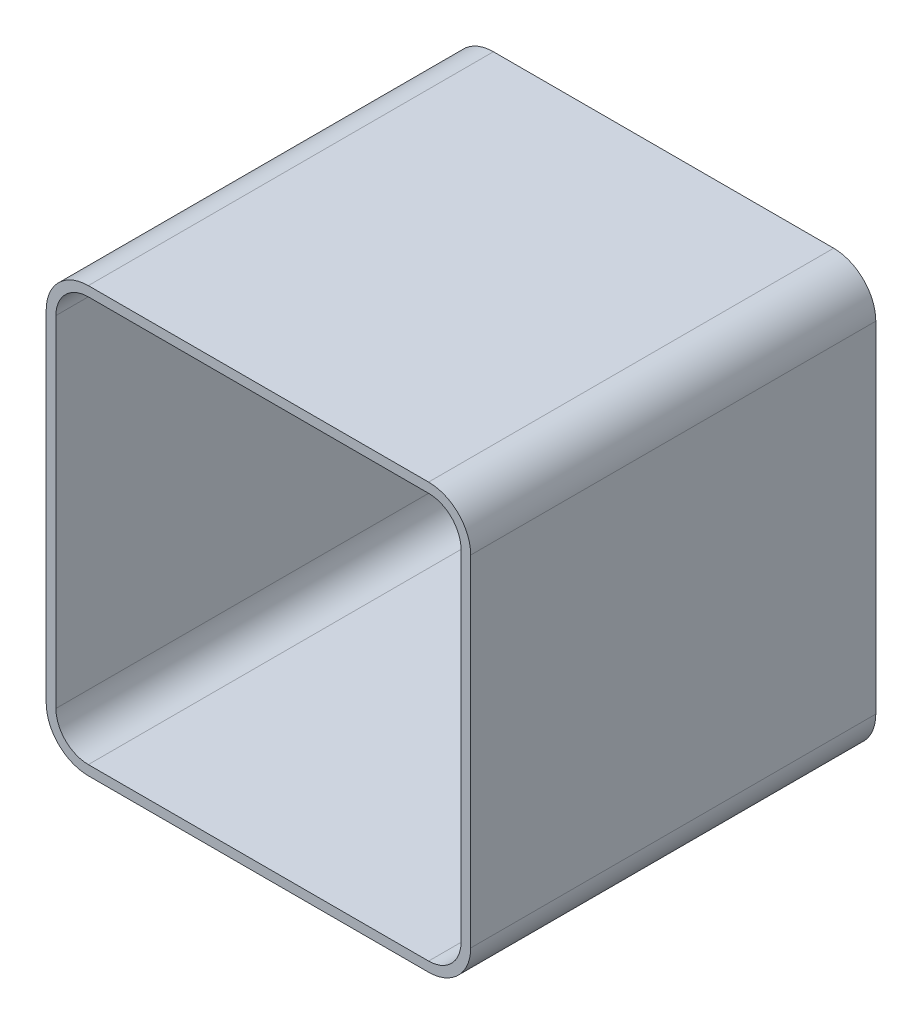
ISO-10303-21;
HEADER;
FILE_DESCRIPTION(('STEP AP214'),'2;1');
FILE_NAME('part.step','',(''),(''),'','','');
FILE_SCHEMA(('AUTOMOTIVE_DESIGN { 1 0 10303 214 1 1 1 1 }'));
ENDSEC;
DATA;
#1=APPLICATION_CONTEXT('core data for automotive mechanical design processes');
#2=APPLICATION_PROTOCOL_DEFINITION('international standard','automotive_design',2000,#1);
#3=PRODUCT_CONTEXT('',#1,'mechanical');
#4=PRODUCT('Part','Part','',(#3));
#5=PRODUCT_RELATED_PRODUCT_CATEGORY('part','',(#4));
#6=PRODUCT_DEFINITION_FORMATION('','',#4);
#7=PRODUCT_DEFINITION_CONTEXT('part definition',#1,'design');
#8=PRODUCT_DEFINITION('design','',#6,#7);
#9=PRODUCT_DEFINITION_SHAPE('','',#8);
#10=(LENGTH_UNIT() NAMED_UNIT(*) SI_UNIT(.MILLI.,.METRE.));
#11=(NAMED_UNIT(*) PLANE_ANGLE_UNIT() SI_UNIT($,.RADIAN.));
#12=(NAMED_UNIT(*) SI_UNIT($,.STERADIAN.) SOLID_ANGLE_UNIT());
#13=UNCERTAINTY_MEASURE_WITH_UNIT(LENGTH_MEASURE(1.E-05),#10,'distance_accuracy_value','');
#14=(GEOMETRIC_REPRESENTATION_CONTEXT(3) GLOBAL_UNCERTAINTY_ASSIGNED_CONTEXT((#13)) GLOBAL_UNIT_ASSIGNED_CONTEXT((#10,
#11,#12)) REPRESENTATION_CONTEXT('',''));
#15=CARTESIAN_POINT('',(0.,0.,0.));
#16=DIRECTION('',(0.,0.,1.));
#17=DIRECTION('',(1.,0.,0.));
#18=AXIS2_PLACEMENT_3D('',#15,#16,#17);
#19=CARTESIAN_POINT('',(0.,0.,25.));
#20=DIRECTION('',(0.,0.,1.));
#21=DIRECTION('',(1.,0.,0.));
#22=AXIS2_PLACEMENT_3D('',#19,#20,#21);
#23=PLANE('',#22);
#24=DIRECTION('',(-1.,0.,0.));
#25=VECTOR('',#24,1.);
#26=CARTESIAN_POINT('',(-13.1,13.1,25.));
#27=LINE('',#26,#25);
#28=CARTESIAN_POINT('',(10.5,13.1,25.));
#29=VERTEX_POINT('',#28);
#30=CARTESIAN_POINT('',(-10.5,13.1,25.));
#31=VERTEX_POINT('',#30);
#32=EDGE_CURVE('E248',#29,#31,#27,.T.);
#33=ORIENTED_EDGE('',*,*,#32,.T.);
#34=CARTESIAN_POINT('',(-10.5,10.5,25.));
#35=DIRECTION('',(0.,0.,1.));
#36=DIRECTION('',(1.,0.,0.));
#37=AXIS2_PLACEMENT_3D('',#34,#35,#36);
#38=CIRCLE('',#37,2.6);
#39=CARTESIAN_POINT('',(-13.1,10.5,25.));
#40=VERTEX_POINT('',#39);
#41=EDGE_CURVE('E230',#31,#40,#38,.T.);
#42=ORIENTED_EDGE('',*,*,#41,.T.);
#43=DIRECTION('',(0.,-1.,0.));
#44=VECTOR('',#43,1.);
#45=CARTESIAN_POINT('',(-13.1,13.1,25.));
#46=LINE('',#45,#44);
#47=CARTESIAN_POINT('',(-13.1,-10.5,25.));
#48=VERTEX_POINT('',#47);
#49=EDGE_CURVE('E176',#40,#48,#46,.T.);
#50=ORIENTED_EDGE('',*,*,#49,.T.);
#51=CARTESIAN_POINT('',(-10.5,-10.5,25.));
#52=DIRECTION('',(0.,0.,1.));
#53=DIRECTION('',(1.,0.,0.));
#54=AXIS2_PLACEMENT_3D('',#51,#52,#53);
#55=CIRCLE('',#54,2.6);
#56=CARTESIAN_POINT('',(-10.5,-13.1,25.));
#57=VERTEX_POINT('',#56);
#58=EDGE_CURVE('E53',#48,#57,#55,.T.);
#59=ORIENTED_EDGE('',*,*,#58,.T.);
#60=DIRECTION('',(1.,0.,0.));
#61=VECTOR('',#60,1.);
#62=CARTESIAN_POINT('',(-13.1,-13.1,25.));
#63=LINE('',#62,#61);
#64=CARTESIAN_POINT('',(10.5,-13.1,25.));
#65=VERTEX_POINT('',#64);
#66=EDGE_CURVE('E172',#57,#65,#63,.T.);
#67=ORIENTED_EDGE('',*,*,#66,.T.);
#68=CARTESIAN_POINT('',(10.5,-10.5,25.));
#69=DIRECTION('',(0.,0.,1.));
#70=DIRECTION('',(1.,0.,0.));
#71=AXIS2_PLACEMENT_3D('',#68,#69,#70);
#72=CIRCLE('',#71,2.6);
#73=CARTESIAN_POINT('',(13.1,-10.5,25.));
#74=VERTEX_POINT('',#73);
#75=EDGE_CURVE('E226',#65,#74,#72,.T.);
#76=ORIENTED_EDGE('',*,*,#75,.T.);
#77=DIRECTION('',(0.,1.,0.));
#78=VECTOR('',#77,1.);
#79=CARTESIAN_POINT('',(13.1,13.1,25.));
#80=LINE('',#79,#78);
#81=CARTESIAN_POINT('',(13.1,10.5,25.));
#82=VERTEX_POINT('',#81);
#83=EDGE_CURVE('E245',#74,#82,#80,.T.);
#84=ORIENTED_EDGE('',*,*,#83,.T.);
#85=CARTESIAN_POINT('',(10.5,10.5,25.));
#86=DIRECTION('',(0.,0.,1.));
#87=DIRECTION('',(1.,0.,0.));
#88=AXIS2_PLACEMENT_3D('',#85,#86,#87);
#89=CIRCLE('',#88,2.6);
#90=EDGE_CURVE('E228',#82,#29,#89,.T.);
#91=ORIENTED_EDGE('',*,*,#90,.T.);
#92=EDGE_LOOP('',(#33,#42,#50,#59,#67,#76,#84,#91));
#93=FACE_BOUND('',#92,.T.);
#94=DIRECTION('',(-1.,0.,0.));
#95=VECTOR('',#94,1.);
#96=CARTESIAN_POINT('',(-12.5,12.5,25.));
#97=LINE('',#96,#95);
#98=CARTESIAN_POINT('',(10.5,12.5,25.));
#99=VERTEX_POINT('',#98);
#100=CARTESIAN_POINT('',(-10.5,12.5,25.));
#101=VERTEX_POINT('',#100);
#102=EDGE_CURVE('E273',#99,#101,#97,.T.);
#103=ORIENTED_EDGE('',*,*,#102,.F.);
#104=CARTESIAN_POINT('',(10.5,10.5,25.));
#105=DIRECTION('',(0.,0.,1.));
#106=DIRECTION('',(1.,0.,0.));
#107=AXIS2_PLACEMENT_3D('',#104,#105,#106);
#108=CIRCLE('',#107,2.);
#109=CARTESIAN_POINT('',(12.5,10.5,25.));
#110=VERTEX_POINT('',#109);
#111=EDGE_CURVE('E158',#99,#110,#108,.F.);
#112=ORIENTED_EDGE('',*,*,#111,.T.);
#113=DIRECTION('',(0.,1.,0.));
#114=VECTOR('',#113,1.);
#115=CARTESIAN_POINT('',(12.5,12.5,25.));
#116=LINE('',#115,#114);
#117=CARTESIAN_POINT('',(12.5,-10.5,25.));
#118=VERTEX_POINT('',#117);
#119=EDGE_CURVE('E263',#118,#110,#116,.T.);
#120=ORIENTED_EDGE('',*,*,#119,.F.);
#121=CARTESIAN_POINT('',(10.5,-10.5,25.));
#122=DIRECTION('',(0.,0.,1.));
#123=DIRECTION('',(1.,0.,0.));
#124=AXIS2_PLACEMENT_3D('',#121,#122,#123);
#125=CIRCLE('',#124,2.);
#126=CARTESIAN_POINT('',(10.5,-12.5,25.));
#127=VERTEX_POINT('',#126);
#128=EDGE_CURVE('E201',#118,#127,#125,.F.);
#129=ORIENTED_EDGE('',*,*,#128,.T.);
#130=DIRECTION('',(1.,0.,0.));
#131=VECTOR('',#130,1.);
#132=CARTESIAN_POINT('',(-12.5,-12.5,25.));
#133=LINE('',#132,#131);
#134=CARTESIAN_POINT('',(-10.5,-12.5,25.));
#135=VERTEX_POINT('',#134);
#136=EDGE_CURVE('E258',#135,#127,#133,.T.);
#137=ORIENTED_EDGE('',*,*,#136,.F.);
#138=CARTESIAN_POINT('',(-10.5,-10.5,25.));
#139=DIRECTION('',(0.,0.,1.));
#140=DIRECTION('',(1.,0.,0.));
#141=AXIS2_PLACEMENT_3D('',#138,#139,#140);
#142=CIRCLE('',#141,2.);
#143=CARTESIAN_POINT('',(-12.5,-10.5,25.));
#144=VERTEX_POINT('',#143);
#145=EDGE_CURVE('E197',#135,#144,#142,.F.);
#146=ORIENTED_EDGE('',*,*,#145,.T.);
#147=DIRECTION('',(0.,-1.,0.));
#148=VECTOR('',#147,1.);
#149=CARTESIAN_POINT('',(-12.5,12.5,25.));
#150=LINE('',#149,#148);
#151=CARTESIAN_POINT('',(-12.5,10.5,25.));
#152=VERTEX_POINT('',#151);
#153=EDGE_CURVE('E271',#152,#144,#150,.T.);
#154=ORIENTED_EDGE('',*,*,#153,.F.);
#155=CARTESIAN_POINT('',(-10.5,10.5,25.));
#156=DIRECTION('',(0.,0.,1.));
#157=DIRECTION('',(1.,0.,0.));
#158=AXIS2_PLACEMENT_3D('',#155,#156,#157);
#159=CIRCLE('',#158,2.);
#160=EDGE_CURVE('E157',#152,#101,#159,.F.);
#161=ORIENTED_EDGE('',*,*,#160,.T.);
#162=EDGE_LOOP('',(#103,#112,#120,#129,#137,#146,#154,#161));
#163=FACE_BOUND('',#162,.T.);
#164=ADVANCED_FACE('F33',(#93,#163),#23,.T.);
#165=CARTESIAN_POINT('',(0.,0.,0.));
#166=DIRECTION('',(0.,0.,1.));
#167=DIRECTION('',(1.,0.,0.));
#168=AXIS2_PLACEMENT_3D('',#165,#166,#167);
#169=PLANE('',#168);
#170=DIRECTION('',(0.,-1.,0.));
#171=VECTOR('',#170,1.);
#172=CARTESIAN_POINT('',(-13.1,13.1,0.));
#173=LINE('',#172,#171);
#174=CARTESIAN_POINT('',(-13.1,10.5,0.));
#175=VERTEX_POINT('',#174);
#176=CARTESIAN_POINT('',(-13.1,-10.5,0.));
#177=VERTEX_POINT('',#176);
#178=EDGE_CURVE('E246',#175,#177,#173,.T.);
#179=ORIENTED_EDGE('',*,*,#178,.F.);
#180=CARTESIAN_POINT('',(-10.5,10.5,0.));
#181=DIRECTION('',(0.,0.,1.));
#182=DIRECTION('',(1.,0.,0.));
#183=AXIS2_PLACEMENT_3D('',#180,#181,#182);
#184=CIRCLE('',#183,2.6);
#185=CARTESIAN_POINT('',(-10.5,13.1,0.));
#186=VERTEX_POINT('',#185);
#187=EDGE_CURVE('E218',#175,#186,#184,.F.);
#188=ORIENTED_EDGE('',*,*,#187,.T.);
#189=DIRECTION('',(-1.,0.,0.));
#190=VECTOR('',#189,1.);
#191=CARTESIAN_POINT('',(-13.1,13.1,0.));
#192=LINE('',#191,#190);
#193=CARTESIAN_POINT('',(10.5,13.1,0.));
#194=VERTEX_POINT('',#193);
#195=EDGE_CURVE('E250',#194,#186,#192,.T.);
#196=ORIENTED_EDGE('',*,*,#195,.F.);
#197=CARTESIAN_POINT('',(10.5,10.5,0.));
#198=DIRECTION('',(0.,0.,1.));
#199=DIRECTION('',(1.,0.,0.));
#200=AXIS2_PLACEMENT_3D('',#197,#198,#199);
#201=CIRCLE('',#200,2.6);
#202=CARTESIAN_POINT('',(13.1,10.5,0.));
#203=VERTEX_POINT('',#202);
#204=EDGE_CURVE('E216',#194,#203,#201,.F.);
#205=ORIENTED_EDGE('',*,*,#204,.T.);
#206=DIRECTION('',(0.,1.,0.));
#207=VECTOR('',#206,1.);
#208=CARTESIAN_POINT('',(13.1,13.1,0.));
#209=LINE('',#208,#207);
#210=CARTESIAN_POINT('',(13.1,-10.5,0.));
#211=VERTEX_POINT('',#210);
#212=EDGE_CURVE('E254',#211,#203,#209,.T.);
#213=ORIENTED_EDGE('',*,*,#212,.F.);
#214=CARTESIAN_POINT('',(10.5,-10.5,0.));
#215=DIRECTION('',(0.,0.,1.));
#216=DIRECTION('',(1.,0.,0.));
#217=AXIS2_PLACEMENT_3D('',#214,#215,#216);
#218=CIRCLE('',#217,2.6);
#219=CARTESIAN_POINT('',(10.5,-13.1,0.));
#220=VERTEX_POINT('',#219);
#221=EDGE_CURVE('E214',#211,#220,#218,.F.);
#222=ORIENTED_EDGE('',*,*,#221,.T.);
#223=DIRECTION('',(1.,0.,0.));
#224=VECTOR('',#223,1.);
#225=CARTESIAN_POINT('',(-13.1,-13.1,0.));
#226=LINE('',#225,#224);
#227=CARTESIAN_POINT('',(-10.5,-13.1,0.));
#228=VERTEX_POINT('',#227);
#229=EDGE_CURVE('E179',#228,#220,#226,.T.);
#230=ORIENTED_EDGE('',*,*,#229,.F.);
#231=CARTESIAN_POINT('',(-10.5,-10.5,0.));
#232=DIRECTION('',(0.,0.,1.));
#233=DIRECTION('',(1.,0.,0.));
#234=AXIS2_PLACEMENT_3D('',#231,#232,#233);
#235=CIRCLE('',#234,2.6);
#236=EDGE_CURVE('E212',#228,#177,#235,.F.);
#237=ORIENTED_EDGE('',*,*,#236,.T.);
#238=EDGE_LOOP('',(#179,#188,#196,#205,#213,#222,#230,#237));
#239=FACE_BOUND('',#238,.T.);
#240=DIRECTION('',(1.,0.,0.));
#241=VECTOR('',#240,1.);
#242=CARTESIAN_POINT('',(-12.5,-12.5,0.));
#243=LINE('',#242,#241);
#244=CARTESIAN_POINT('',(-10.5,-12.5,0.));
#245=VERTEX_POINT('',#244);
#246=CARTESIAN_POINT('',(10.5,-12.5,0.));
#247=VERTEX_POINT('',#246);
#248=EDGE_CURVE('E168',#245,#247,#243,.T.);
#249=ORIENTED_EDGE('',*,*,#248,.T.);
#250=CARTESIAN_POINT('',(10.5,-10.5,0.));
#251=DIRECTION('',(0.,0.,1.));
#252=DIRECTION('',(1.,0.,0.));
#253=AXIS2_PLACEMENT_3D('',#250,#251,#252);
#254=CIRCLE('',#253,2.);
#255=CARTESIAN_POINT('',(12.5,-10.5,0.));
#256=VERTEX_POINT('',#255);
#257=EDGE_CURVE('E199',#247,#256,#254,.T.);
#258=ORIENTED_EDGE('',*,*,#257,.T.);
#259=DIRECTION('',(0.,1.,0.));
#260=VECTOR('',#259,1.);
#261=CARTESIAN_POINT('',(12.5,12.5,0.));
#262=LINE('',#261,#260);
#263=CARTESIAN_POINT('',(12.5,10.5,0.));
#264=VERTEX_POINT('',#263);
#265=EDGE_CURVE('E266',#256,#264,#262,.T.);
#266=ORIENTED_EDGE('',*,*,#265,.T.);
#267=CARTESIAN_POINT('',(10.5,10.5,0.));
#268=DIRECTION('',(0.,0.,1.));
#269=DIRECTION('',(1.,0.,0.));
#270=AXIS2_PLACEMENT_3D('',#267,#268,#269);
#271=CIRCLE('',#270,2.);
#272=CARTESIAN_POINT('',(10.5,12.5,0.));
#273=VERTEX_POINT('',#272);
#274=EDGE_CURVE('E203',#264,#273,#271,.T.);
#275=ORIENTED_EDGE('',*,*,#274,.T.);
#276=DIRECTION('',(-1.,0.,0.));
#277=VECTOR('',#276,1.);
#278=CARTESIAN_POINT('',(-12.5,12.5,0.));
#279=LINE('',#278,#277);
#280=CARTESIAN_POINT('',(-10.5,12.5,0.));
#281=VERTEX_POINT('',#280);
#282=EDGE_CURVE('E152',#273,#281,#279,.T.);
#283=ORIENTED_EDGE('',*,*,#282,.T.);
#284=CARTESIAN_POINT('',(-10.5,10.5,0.));
#285=DIRECTION('',(0.,0.,1.));
#286=DIRECTION('',(1.,0.,0.));
#287=AXIS2_PLACEMENT_3D('',#284,#285,#286);
#288=CIRCLE('',#287,2.);
#289=CARTESIAN_POINT('',(-12.5,10.5,0.));
#290=VERTEX_POINT('',#289);
#291=EDGE_CURVE('E146',#281,#290,#288,.T.);
#292=ORIENTED_EDGE('',*,*,#291,.T.);
#293=DIRECTION('',(0.,-1.,0.));
#294=VECTOR('',#293,1.);
#295=CARTESIAN_POINT('',(-12.5,12.5,0.));
#296=LINE('',#295,#294);
#297=CARTESIAN_POINT('',(-12.5,-10.5,0.));
#298=VERTEX_POINT('',#297);
#299=EDGE_CURVE('E150',#290,#298,#296,.T.);
#300=ORIENTED_EDGE('',*,*,#299,.T.);
#301=CARTESIAN_POINT('',(-10.5,-10.5,0.));
#302=DIRECTION('',(0.,0.,1.));
#303=DIRECTION('',(1.,0.,0.));
#304=AXIS2_PLACEMENT_3D('',#301,#302,#303);
#305=CIRCLE('',#304,2.);
#306=EDGE_CURVE('E195',#298,#245,#305,.T.);
#307=ORIENTED_EDGE('',*,*,#306,.T.);
#308=EDGE_LOOP('',(#249,#258,#266,#275,#283,#292,#300,#307));
#309=FACE_BOUND('',#308,.T.);
#310=ADVANCED_FACE('F149',(#239,#309),#169,.F.);
#311=CARTESIAN_POINT('',(13.1,13.1,25.));
#312=DIRECTION('',(-1.,0.,0.));
#313=DIRECTION('',(0.,0.,1.));
#314=AXIS2_PLACEMENT_3D('',#311,#312,#313);
#315=PLANE('',#314);
#316=ORIENTED_EDGE('',*,*,#212,.T.);
#317=DIRECTION('',(0.,0.,-1.));
#318=VECTOR('',#317,1.);
#319=CARTESIAN_POINT('',(13.1,10.5,25.));
#320=LINE('',#319,#318);
#321=EDGE_CURVE('E235',#203,#82,#320,.F.);
#322=ORIENTED_EDGE('',*,*,#321,.T.);
#323=ORIENTED_EDGE('',*,*,#83,.F.);
#324=DIRECTION('',(0.,0.,-1.));
#325=VECTOR('',#324,1.);
#326=CARTESIAN_POINT('',(13.1,-10.5,25.));
#327=LINE('',#326,#325);
#328=EDGE_CURVE('E232',#74,#211,#327,.T.);
#329=ORIENTED_EDGE('',*,*,#328,.T.);
#330=EDGE_LOOP('',(#316,#322,#323,#329));
#331=FACE_BOUND('',#330,.T.);
#332=ADVANCED_FACE('F316',(#331),#315,.F.);
#333=CARTESIAN_POINT('',(-13.1,13.1,25.));
#334=DIRECTION('',(0.,-1.,0.));
#335=DIRECTION('',(0.,0.,-1.));
#336=AXIS2_PLACEMENT_3D('',#333,#334,#335);
#337=PLANE('',#336);
#338=ORIENTED_EDGE('',*,*,#195,.T.);
#339=DIRECTION('',(0.,0.,-1.));
#340=VECTOR('',#339,1.);
#341=CARTESIAN_POINT('',(-10.5,13.1,25.));
#342=LINE('',#341,#340);
#343=EDGE_CURVE('E223',#186,#31,#342,.F.);
#344=ORIENTED_EDGE('',*,*,#343,.T.);
#345=ORIENTED_EDGE('',*,*,#32,.F.);
#346=DIRECTION('',(0.,0.,-1.));
#347=VECTOR('',#346,1.);
#348=CARTESIAN_POINT('',(10.5,13.1,25.));
#349=LINE('',#348,#347);
#350=EDGE_CURVE('E220',#29,#194,#349,.T.);
#351=ORIENTED_EDGE('',*,*,#350,.T.);
#352=EDGE_LOOP('',(#338,#344,#345,#351));
#353=FACE_BOUND('',#352,.T.);
#354=ADVANCED_FACE('F326',(#353),#337,.F.);
#355=CARTESIAN_POINT('',(-13.1,13.1,25.));
#356=DIRECTION('',(1.,0.,0.));
#357=DIRECTION('',(0.,0.,-1.));
#358=AXIS2_PLACEMENT_3D('',#355,#356,#357);
#359=PLANE('',#358);
#360=ORIENTED_EDGE('',*,*,#49,.F.);
#361=DIRECTION('',(0.,0.,-1.));
#362=VECTOR('',#361,1.);
#363=CARTESIAN_POINT('',(-13.1,10.5,25.));
#364=LINE('',#363,#362);
#365=EDGE_CURVE('E209',#40,#175,#364,.T.);
#366=ORIENTED_EDGE('',*,*,#365,.T.);
#367=ORIENTED_EDGE('',*,*,#178,.T.);
#368=DIRECTION('',(0.,0.,-1.));
#369=VECTOR('',#368,1.);
#370=CARTESIAN_POINT('',(-13.1,-10.5,25.));
#371=LINE('',#370,#369);
#372=EDGE_CURVE('E207',#177,#48,#371,.F.);
#373=ORIENTED_EDGE('',*,*,#372,.T.);
#374=EDGE_LOOP('',(#360,#366,#367,#373));
#375=FACE_BOUND('',#374,.T.);
#376=ADVANCED_FACE('F323',(#375),#359,.F.);
#377=CARTESIAN_POINT('',(-13.1,-13.1,25.));
#378=DIRECTION('',(0.,1.,0.));
#379=DIRECTION('',(0.,0.,1.));
#380=AXIS2_PLACEMENT_3D('',#377,#378,#379);
#381=PLANE('',#380);
#382=ORIENTED_EDGE('',*,*,#229,.T.);
#383=DIRECTION('',(0.,0.,-1.));
#384=VECTOR('',#383,1.);
#385=CARTESIAN_POINT('',(10.5,-13.1,25.));
#386=LINE('',#385,#384);
#387=EDGE_CURVE('E11',#220,#65,#386,.F.);
#388=ORIENTED_EDGE('',*,*,#387,.T.);
#389=ORIENTED_EDGE('',*,*,#66,.F.);
#390=DIRECTION('',(0.,0.,-1.));
#391=VECTOR('',#390,1.);
#392=CARTESIAN_POINT('',(-10.5,-13.1,25.));
#393=LINE('',#392,#391);
#394=EDGE_CURVE('E41',#57,#228,#393,.T.);
#395=ORIENTED_EDGE('',*,*,#394,.T.);
#396=EDGE_LOOP('',(#382,#388,#389,#395));
#397=FACE_BOUND('',#396,.T.);
#398=ADVANCED_FACE('F239',(#397),#381,.F.);
#399=CARTESIAN_POINT('',(12.5,12.5,25.));
#400=DIRECTION('',(-1.,0.,0.));
#401=DIRECTION('',(0.,0.,1.));
#402=AXIS2_PLACEMENT_3D('',#399,#400,#401);
#403=PLANE('',#402);
#404=ORIENTED_EDGE('',*,*,#265,.F.);
#405=DIRECTION('',(0.,0.,-1.));
#406=VECTOR('',#405,1.);
#407=CARTESIAN_POINT('',(12.5,-10.5,25.));
#408=LINE('',#407,#406);
#409=EDGE_CURVE('E189',#256,#118,#408,.F.);
#410=ORIENTED_EDGE('',*,*,#409,.T.);
#411=ORIENTED_EDGE('',*,*,#119,.T.);
#412=DIRECTION('',(0.,0.,-1.));
#413=VECTOR('',#412,1.);
#414=CARTESIAN_POINT('',(12.5,10.5,0.));
#415=LINE('',#414,#413);
#416=EDGE_CURVE('E186',#110,#264,#415,.T.);
#417=ORIENTED_EDGE('',*,*,#416,.T.);
#418=EDGE_LOOP('',(#404,#410,#411,#417));
#419=FACE_BOUND('',#418,.T.);
#420=ADVANCED_FACE('F281',(#419),#403,.T.);
#421=CARTESIAN_POINT('',(-12.5,12.5,25.));
#422=DIRECTION('',(0.,-1.,0.));
#423=DIRECTION('',(0.,0.,-1.));
#424=AXIS2_PLACEMENT_3D('',#421,#422,#423);
#425=PLANE('',#424);
#426=ORIENTED_EDGE('',*,*,#282,.F.);
#427=DIRECTION('',(0.,0.,-1.));
#428=VECTOR('',#427,1.);
#429=CARTESIAN_POINT('',(10.5,12.5,25.));
#430=LINE('',#429,#428);
#431=EDGE_CURVE('E193',#273,#99,#430,.F.);
#432=ORIENTED_EDGE('',*,*,#431,.T.);
#433=ORIENTED_EDGE('',*,*,#102,.T.);
#434=DIRECTION('',(0.,0.,-1.));
#435=VECTOR('',#434,1.);
#436=CARTESIAN_POINT('',(-10.5,12.5,0.));
#437=LINE('',#436,#435);
#438=EDGE_CURVE('E191',#101,#281,#437,.T.);
#439=ORIENTED_EDGE('',*,*,#438,.T.);
#440=EDGE_LOOP('',(#426,#432,#433,#439));
#441=FACE_BOUND('',#440,.T.);
#442=ADVANCED_FACE('F290',(#441),#425,.T.);
#443=CARTESIAN_POINT('',(-12.5,12.5,25.));
#444=DIRECTION('',(1.,0.,0.));
#445=DIRECTION('',(0.,0.,-1.));
#446=AXIS2_PLACEMENT_3D('',#443,#444,#445);
#447=PLANE('',#446);
#448=ORIENTED_EDGE('',*,*,#153,.T.);
#449=DIRECTION('',(0.,0.,-1.));
#450=VECTOR('',#449,1.);
#451=CARTESIAN_POINT('',(-12.5,-10.5,0.));
#452=LINE('',#451,#450);
#453=EDGE_CURVE('E167',#144,#298,#452,.T.);
#454=ORIENTED_EDGE('',*,*,#453,.T.);
#455=ORIENTED_EDGE('',*,*,#299,.F.);
#456=DIRECTION('',(0.,0.,-1.));
#457=VECTOR('',#456,1.);
#458=CARTESIAN_POINT('',(-12.5,10.5,25.));
#459=LINE('',#458,#457);
#460=EDGE_CURVE('E164',#290,#152,#459,.F.);
#461=ORIENTED_EDGE('',*,*,#460,.T.);
#462=EDGE_LOOP('',(#448,#454,#455,#461));
#463=FACE_BOUND('',#462,.T.);
#464=ADVANCED_FACE('F163',(#463),#447,.T.);
#465=CARTESIAN_POINT('',(-12.5,-12.5,25.));
#466=DIRECTION('',(0.,1.,0.));
#467=DIRECTION('',(0.,0.,1.));
#468=AXIS2_PLACEMENT_3D('',#465,#466,#467);
#469=PLANE('',#468);
#470=ORIENTED_EDGE('',*,*,#248,.F.);
#471=DIRECTION('',(0.,0.,-1.));
#472=VECTOR('',#471,1.);
#473=CARTESIAN_POINT('',(-10.5,-12.5,25.));
#474=LINE('',#473,#472);
#475=EDGE_CURVE('E184',#245,#135,#474,.F.);
#476=ORIENTED_EDGE('',*,*,#475,.T.);
#477=ORIENTED_EDGE('',*,*,#136,.T.);
#478=DIRECTION('',(0.,0.,-1.));
#479=VECTOR('',#478,1.);
#480=CARTESIAN_POINT('',(10.5,-12.5,0.));
#481=LINE('',#480,#479);
#482=EDGE_CURVE('E174',#127,#247,#481,.T.);
#483=ORIENTED_EDGE('',*,*,#482,.T.);
#484=EDGE_LOOP('',(#470,#476,#477,#483));
#485=FACE_BOUND('',#484,.T.);
#486=ADVANCED_FACE('F299',(#485),#469,.T.);
#487=CARTESIAN_POINT('',(-10.5,-10.5,25.));
#488=DIRECTION('',(0.,0.,1.));
#489=DIRECTION('',(1.,0.,0.));
#490=AXIS2_PLACEMENT_3D('',#487,#488,#489);
#491=CYLINDRICAL_SURFACE('',#490,2.);
#492=ORIENTED_EDGE('',*,*,#145,.F.);
#493=ORIENTED_EDGE('',*,*,#475,.F.);
#494=ORIENTED_EDGE('',*,*,#306,.F.);
#495=ORIENTED_EDGE('',*,*,#453,.F.);
#496=EDGE_LOOP('',(#492,#493,#494,#495));
#497=FACE_BOUND('',#496,.T.);
#498=ADVANCED_FACE('F295',(#497),#491,.F.);
#499=CARTESIAN_POINT('',(10.5,-10.5,25.));
#500=DIRECTION('',(0.,0.,1.));
#501=DIRECTION('',(1.,0.,0.));
#502=AXIS2_PLACEMENT_3D('',#499,#500,#501);
#503=CYLINDRICAL_SURFACE('',#502,2.);
#504=ORIENTED_EDGE('',*,*,#128,.F.);
#505=ORIENTED_EDGE('',*,*,#409,.F.);
#506=ORIENTED_EDGE('',*,*,#257,.F.);
#507=ORIENTED_EDGE('',*,*,#482,.F.);
#508=EDGE_LOOP('',(#504,#505,#506,#507));
#509=FACE_BOUND('',#508,.T.);
#510=ADVANCED_FACE('F302',(#509),#503,.F.);
#511=CARTESIAN_POINT('',(10.5,10.5,25.));
#512=DIRECTION('',(0.,0.,1.));
#513=DIRECTION('',(1.,0.,0.));
#514=AXIS2_PLACEMENT_3D('',#511,#512,#513);
#515=CYLINDRICAL_SURFACE('',#514,2.);
#516=ORIENTED_EDGE('',*,*,#111,.F.);
#517=ORIENTED_EDGE('',*,*,#431,.F.);
#518=ORIENTED_EDGE('',*,*,#274,.F.);
#519=ORIENTED_EDGE('',*,*,#416,.F.);
#520=EDGE_LOOP('',(#516,#517,#518,#519));
#521=FACE_BOUND('',#520,.T.);
#522=ADVANCED_FACE('F287',(#521),#515,.F.);
#523=CARTESIAN_POINT('',(-10.5,10.5,25.));
#524=DIRECTION('',(0.,0.,1.));
#525=DIRECTION('',(1.,0.,0.));
#526=AXIS2_PLACEMENT_3D('',#523,#524,#525);
#527=CYLINDRICAL_SURFACE('',#526,2.);
#528=ORIENTED_EDGE('',*,*,#160,.F.);
#529=ORIENTED_EDGE('',*,*,#460,.F.);
#530=ORIENTED_EDGE('',*,*,#291,.F.);
#531=ORIENTED_EDGE('',*,*,#438,.F.);
#532=EDGE_LOOP('',(#528,#529,#530,#531));
#533=FACE_BOUND('',#532,.T.);
#534=ADVANCED_FACE('F171',(#533),#527,.F.);
#535=CARTESIAN_POINT('',(-10.5,10.5,25.));
#536=DIRECTION('',(0.,0.,-1.));
#537=DIRECTION('',(-1.,0.,0.));
#538=AXIS2_PLACEMENT_3D('',#535,#536,#537);
#539=CYLINDRICAL_SURFACE('',#538,2.6);
#540=ORIENTED_EDGE('',*,*,#41,.F.);
#541=ORIENTED_EDGE('',*,*,#343,.F.);
#542=ORIENTED_EDGE('',*,*,#187,.F.);
#543=ORIENTED_EDGE('',*,*,#365,.F.);
#544=EDGE_LOOP('',(#540,#541,#542,#543));
#545=FACE_BOUND('',#544,.T.);
#546=ADVANCED_FACE('F346',(#545),#539,.T.);
#547=CARTESIAN_POINT('',(10.5,10.5,25.));
#548=DIRECTION('',(0.,0.,-1.));
#549=DIRECTION('',(-1.,0.,0.));
#550=AXIS2_PLACEMENT_3D('',#547,#548,#549);
#551=CYLINDRICAL_SURFACE('',#550,2.6);
#552=ORIENTED_EDGE('',*,*,#90,.F.);
#553=ORIENTED_EDGE('',*,*,#321,.F.);
#554=ORIENTED_EDGE('',*,*,#204,.F.);
#555=ORIENTED_EDGE('',*,*,#350,.F.);
#556=EDGE_LOOP('',(#552,#553,#554,#555));
#557=FACE_BOUND('',#556,.T.);
#558=ADVANCED_FACE('F339',(#557),#551,.T.);
#559=CARTESIAN_POINT('',(10.5,-10.5,25.));
#560=DIRECTION('',(0.,0.,-1.));
#561=DIRECTION('',(-1.,0.,0.));
#562=AXIS2_PLACEMENT_3D('',#559,#560,#561);
#563=CYLINDRICAL_SURFACE('',#562,2.6);
#564=ORIENTED_EDGE('',*,*,#75,.F.);
#565=ORIENTED_EDGE('',*,*,#387,.F.);
#566=ORIENTED_EDGE('',*,*,#221,.F.);
#567=ORIENTED_EDGE('',*,*,#328,.F.);
#568=EDGE_LOOP('',(#564,#565,#566,#567));
#569=FACE_BOUND('',#568,.T.);
#570=ADVANCED_FACE('F350',(#569),#563,.T.);
#571=CARTESIAN_POINT('',(-10.5,-10.5,25.));
#572=DIRECTION('',(0.,0.,-1.));
#573=DIRECTION('',(-1.,0.,0.));
#574=AXIS2_PLACEMENT_3D('',#571,#572,#573);
#575=CYLINDRICAL_SURFACE('',#574,2.6);
#576=ORIENTED_EDGE('',*,*,#58,.F.);
#577=ORIENTED_EDGE('',*,*,#372,.F.);
#578=ORIENTED_EDGE('',*,*,#236,.F.);
#579=ORIENTED_EDGE('',*,*,#394,.F.);
#580=EDGE_LOOP('',(#576,#577,#578,#579));
#581=FACE_BOUND('',#580,.T.);
#582=ADVANCED_FACE('F35',(#581),#575,.T.);
#583=CLOSED_SHELL('',(#164,#310,#332,#354,#376,#398,#420,#442,#464,#486,#498,#510,#522,#534,
#546,#558,#570,#582));
#584=MANIFOLD_SOLID_BREP('B2',#583);
#585=ADVANCED_BREP_SHAPE_REPRESENTATION('',(#18,#584),#14);
#586=SHAPE_DEFINITION_REPRESENTATION(#9,#585);
ENDSEC;
END-ISO-10303-21;
